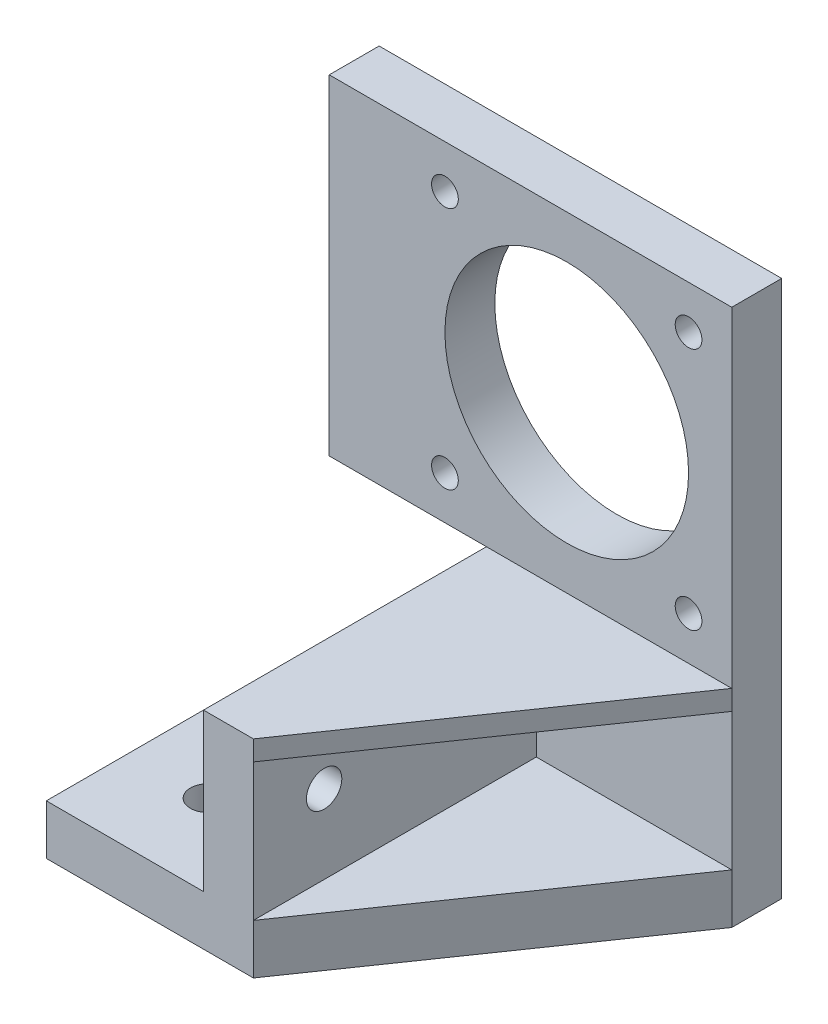
ISO-10303-21;
HEADER;
FILE_DESCRIPTION(('STEP AP214'),'2;1');
FILE_NAME('part.step','',(''),(''),'','','');
FILE_SCHEMA(('AUTOMOTIVE_DESIGN { 1 0 10303 214 1 1 1 1 }'));
ENDSEC;
DATA;
#1=APPLICATION_CONTEXT('core data for automotive mechanical design processes');
#2=APPLICATION_PROTOCOL_DEFINITION('international standard','automotive_design',2000,#1);
#3=PRODUCT_CONTEXT('',#1,'mechanical');
#4=PRODUCT('Part','Part','',(#3));
#5=PRODUCT_RELATED_PRODUCT_CATEGORY('part','',(#4));
#6=PRODUCT_DEFINITION_FORMATION('','',#4);
#7=PRODUCT_DEFINITION_CONTEXT('part definition',#1,'design');
#8=PRODUCT_DEFINITION('design','',#6,#7);
#9=PRODUCT_DEFINITION_SHAPE('','',#8);
#10=(LENGTH_UNIT() NAMED_UNIT(*) SI_UNIT(.MILLI.,.METRE.));
#11=(NAMED_UNIT(*) PLANE_ANGLE_UNIT() SI_UNIT($,.RADIAN.));
#12=(NAMED_UNIT(*) SI_UNIT($,.STERADIAN.) SOLID_ANGLE_UNIT());
#13=UNCERTAINTY_MEASURE_WITH_UNIT(LENGTH_MEASURE(1.E-05),#10,'distance_accuracy_value','');
#14=(GEOMETRIC_REPRESENTATION_CONTEXT(3) GLOBAL_UNCERTAINTY_ASSIGNED_CONTEXT((#13)) GLOBAL_UNIT_ASSIGNED_CONTEXT((#10,
#11,#12)) REPRESENTATION_CONTEXT('',''));
#15=CARTESIAN_POINT('',(0.,0.,0.));
#16=DIRECTION('',(0.,0.,1.));
#17=DIRECTION('',(1.,0.,0.));
#18=AXIS2_PLACEMENT_3D('',#15,#16,#17);
#19=CARTESIAN_POINT('',(0.,0.,78.0386444913883));
#20=DIRECTION('',(0.,0.,-1.));
#21=DIRECTION('',(-1.,0.,0.));
#22=AXIS2_PLACEMENT_3D('',#19,#20,#21);
#23=PLANE('',#22);
#24=CARTESIAN_POINT('',(4.72008915368407,15.4999999999972,78.0386444913883));
#25=DIRECTION('',(0.,0.,-1.));
#26=DIRECTION('',(-1.,0.,0.));
#27=AXIS2_PLACEMENT_3D('',#24,#25,#26);
#28=CIRCLE('',#27,1.7);
#29=CARTESIAN_POINT('',(3.02008915368406,15.4999999999972,78.0386444913883));
#30=VERTEX_POINT('',#29);
#31=EDGE_CURVE('E173',#30,#30,#28,.T.);
#32=ORIENTED_EDGE('',*,*,#31,.T.);
#33=EDGE_LOOP('',(#32));
#34=FACE_BOUND('',#33,.T.);
#35=CARTESIAN_POINT('',(20.2200891536841,30.9999999999972,78.0386444913883));
#36=DIRECTION('',(0.,0.,-1.));
#37=DIRECTION('',(-1.,0.,0.));
#38=AXIS2_PLACEMENT_3D('',#35,#36,#37);
#39=CIRCLE('',#38,15.5);
#40=CARTESIAN_POINT('',(4.72008915368407,30.9999999999972,78.0386444913883));
#41=VERTEX_POINT('',#40);
#42=EDGE_CURVE('E247',#41,#41,#39,.T.);
#43=ORIENTED_EDGE('',*,*,#42,.T.);
#44=EDGE_LOOP('',(#43));
#45=FACE_BOUND('',#44,.T.);
#46=CARTESIAN_POINT('',(4.72008915368407,46.4999999999972,78.0386444913883));
#47=DIRECTION('',(0.,0.,-1.));
#48=DIRECTION('',(-1.,0.,0.));
#49=AXIS2_PLACEMENT_3D('',#46,#47,#48);
#50=CIRCLE('',#49,1.7);
#51=CARTESIAN_POINT('',(3.02008915368407,46.4999999999972,78.0386444913883));
#52=VERTEX_POINT('',#51);
#53=EDGE_CURVE('E250',#52,#52,#50,.T.);
#54=ORIENTED_EDGE('',*,*,#53,.T.);
#55=EDGE_LOOP('',(#54));
#56=FACE_BOUND('',#55,.T.);
#57=CARTESIAN_POINT('',(35.7200891536841,46.4999999999972,78.0386444913883));
#58=DIRECTION('',(0.,0.,-1.));
#59=DIRECTION('',(-1.,0.,0.));
#60=AXIS2_PLACEMENT_3D('',#57,#58,#59);
#61=CIRCLE('',#60,1.7);
#62=CARTESIAN_POINT('',(34.0200891536841,46.4999999999972,78.0386444913883));
#63=VERTEX_POINT('',#62);
#64=EDGE_CURVE('E253',#63,#63,#61,.T.);
#65=ORIENTED_EDGE('',*,*,#64,.T.);
#66=EDGE_LOOP('',(#65));
#67=FACE_BOUND('',#66,.T.);
#68=CARTESIAN_POINT('',(35.7200891536841,15.4999999999972,78.0386444913883));
#69=DIRECTION('',(0.,0.,-1.));
#70=DIRECTION('',(-1.,0.,0.));
#71=AXIS2_PLACEMENT_3D('',#68,#69,#70);
#72=CIRCLE('',#71,1.7);
#73=CARTESIAN_POINT('',(34.0200891536841,15.4999999999972,78.0386444913883));
#74=VERTEX_POINT('',#73);
#75=EDGE_CURVE('E256',#74,#74,#72,.T.);
#76=ORIENTED_EDGE('',*,*,#75,.T.);
#77=EDGE_LOOP('',(#76));
#78=FACE_BOUND('',#77,.T.);
#79=DIRECTION('',(1.,0.,0.));
#80=VECTOR('',#79,1.);
#81=CARTESIAN_POINT('',(0.,9.99999999999721,78.0386444913883));
#82=LINE('',#81,#80);
#83=CARTESIAN_POINT('',(9.99999999991598,9.99999999999721,78.0386444913883));
#84=VERTEX_POINT('',#83);
#85=CARTESIAN_POINT('',(41.2200891536841,9.99999999999721,78.0386444913883));
#86=VERTEX_POINT('',#85);
#87=EDGE_CURVE('E164',#84,#86,#82,.T.);
#88=ORIENTED_EDGE('',*,*,#87,.T.);
#89=DIRECTION('',(0.,1.,0.));
#90=VECTOR('',#89,1.);
#91=CARTESIAN_POINT('',(41.2200891536841,0.,78.0386444913883));
#92=LINE('',#91,#90);
#93=CARTESIAN_POINT('',(41.2200891536841,51.9999999999972,78.0386444913883));
#94=VERTEX_POINT('',#93);
#95=EDGE_CURVE('E166',#86,#94,#92,.T.);
#96=ORIENTED_EDGE('',*,*,#95,.T.);
#97=DIRECTION('',(1.,0.,0.));
#98=VECTOR('',#97,1.);
#99=CARTESIAN_POINT('',(0.,51.9999999999972,78.0386444913883));
#100=LINE('',#99,#98);
#101=CARTESIAN_POINT('',(-10.0000000001687,51.9999999999972,78.0386444913883));
#102=VERTEX_POINT('',#101);
#103=EDGE_CURVE('E184',#102,#94,#100,.T.);
#104=ORIENTED_EDGE('',*,*,#103,.F.);
#105=DIRECTION('',(0.,1.,0.));
#106=VECTOR('',#105,1.);
#107=CARTESIAN_POINT('',(-10.0000000001687,9.99999999999721,78.0386444913883));
#108=LINE('',#107,#106);
#109=CARTESIAN_POINT('',(-10.0000000001687,9.99999999999721,78.0386444913883));
#110=VERTEX_POINT('',#109);
#111=EDGE_CURVE('E286',#110,#102,#108,.T.);
#112=ORIENTED_EDGE('',*,*,#111,.F.);
#113=EDGE_CURVE('E169',#110,#84,#82,.T.);
#114=ORIENTED_EDGE('',*,*,#113,.T.);
#115=EDGE_LOOP('',(#88,#96,#104,#112,#114));
#116=FACE_BOUND('',#115,.T.);
#117=ADVANCED_FACE('F67',(#34,#45,#56,#67,#78,#116),#23,.F.);
#118=CARTESIAN_POINT('',(16.349999999916,0.,71.6886444913883));
#119=DIRECTION('',(-1.,0.,0.));
#120=DIRECTION('',(0.,0.,1.));
#121=AXIS2_PLACEMENT_3D('',#118,#119,#120);
#122=PLANE('',#121);
#123=CARTESIAN_POINT('',(16.349999999916,0.,105.038644402888));
#124=DIRECTION('',(1.,0.,0.));
#125=DIRECTION('',(0.,0.,-1.));
#126=AXIS2_PLACEMENT_3D('',#123,#124,#125);
#127=CIRCLE('',#126,2.24999999999999);
#128=CARTESIAN_POINT('',(16.349999999916,0.,102.788644402888));
#129=VERTEX_POINT('',#128);
#130=EDGE_CURVE('E217',#129,#129,#127,.T.);
#131=ORIENTED_EDGE('',*,*,#130,.F.);
#132=EDGE_LOOP('',(#131));
#133=FACE_BOUND('',#132,.T.);
#134=CARTESIAN_POINT('',(16.349999999916,0.,87.0386444618883));
#135=DIRECTION('',(1.,0.,0.));
#136=DIRECTION('',(0.,0.,-1.));
#137=AXIS2_PLACEMENT_3D('',#134,#135,#136);
#138=CIRCLE('',#137,2.24999999999999);
#139=CARTESIAN_POINT('',(16.349999999916,0.,84.7886444618883));
#140=VERTEX_POINT('',#139);
#141=EDGE_CURVE('E220',#140,#140,#138,.T.);
#142=ORIENTED_EDGE('',*,*,#141,.F.);
#143=EDGE_LOOP('',(#142));
#144=FACE_BOUND('',#143,.T.);
#145=DIRECTION('',(0.,-1.,0.));
#146=VECTOR('',#145,1.);
#147=CARTESIAN_POINT('',(16.349999999916,0.,78.0386444913883));
#148=LINE('',#147,#146);
#149=CARTESIAN_POINT('',(16.349999999916,7.45999999999721,78.0386444913883));
#150=VERTEX_POINT('',#149);
#151=CARTESIAN_POINT('',(16.349999999916,-10.0000000000028,78.0386444913883));
#152=VERTEX_POINT('',#151);
#153=EDGE_CURVE('E245',#150,#152,#148,.T.);
#154=ORIENTED_EDGE('',*,*,#153,.F.);
#155=DIRECTION('',(0.,0.,1.));
#156=VECTOR('',#155,1.);
#157=CARTESIAN_POINT('',(16.349999999916,7.45999999999721,78.0386444913883));
#158=LINE('',#157,#156);
#159=CARTESIAN_POINT('',(16.349999999916,7.45999999999721,114.038644373388));
#160=VERTEX_POINT('',#159);
#161=EDGE_CURVE('E91',#150,#160,#158,.T.);
#162=ORIENTED_EDGE('',*,*,#161,.T.);
#163=DIRECTION('',(0.,-1.,0.));
#164=VECTOR('',#163,1.);
#165=CARTESIAN_POINT('',(16.349999999916,0.,114.038644373388));
#166=LINE('',#165,#164);
#167=CARTESIAN_POINT('',(16.349999999916,-10.0000000000028,114.038644373388));
#168=VERTEX_POINT('',#167);
#169=EDGE_CURVE('E284',#160,#168,#166,.T.);
#170=ORIENTED_EDGE('',*,*,#169,.T.);
#171=DIRECTION('',(0.,0.,-1.));
#172=VECTOR('',#171,1.);
#173=CARTESIAN_POINT('',(16.349999999916,-10.0000000000028,78.0386444913883));
#174=LINE('',#173,#172);
#175=EDGE_CURVE('E227',#168,#152,#174,.T.);
#176=ORIENTED_EDGE('',*,*,#175,.T.);
#177=EDGE_LOOP('',(#154,#162,#170,#176));
#178=FACE_BOUND('',#177,.T.);
#179=ADVANCED_FACE('F69',(#133,#144,#178),#122,.F.);
#180=CARTESIAN_POINT('',(41.2200891536841,-10.0000000000028,78.0386444913883));
#181=VERTEX_POINT('',#180);
#182=CARTESIAN_POINT('',(41.2200891536841,7.45999999999721,78.0386444913883));
#183=VERTEX_POINT('',#182);
#184=EDGE_CURVE('E183',#181,#183,#92,.T.);
#185=ORIENTED_EDGE('',*,*,#184,.T.);
#186=DIRECTION('',(-1.,0.,0.));
#187=VECTOR('',#186,1.);
#188=CARTESIAN_POINT('',(41.2200891536841,7.45999999999721,78.0386444913883));
#189=LINE('',#188,#187);
#190=EDGE_CURVE('E84',#183,#150,#189,.T.);
#191=ORIENTED_EDGE('',*,*,#190,.T.);
#192=ORIENTED_EDGE('',*,*,#153,.T.);
#193=DIRECTION('',(1.,0.,0.));
#194=VECTOR('',#193,1.);
#195=CARTESIAN_POINT('',(41.2200891536841,-10.0000000000028,78.0386444913883));
#196=LINE('',#195,#194);
#197=EDGE_CURVE('E230',#152,#181,#196,.T.);
#198=ORIENTED_EDGE('',*,*,#197,.T.);
#199=EDGE_LOOP('',(#185,#191,#192,#198));
#200=FACE_BOUND('',#199,.T.);
#201=ADVANCED_FACE('F348',(#200),#23,.F.);
#202=CARTESIAN_POINT('',(0.,9.99999999999721,71.6886444913883));
#203=DIRECTION('',(0.,1.,0.));
#204=DIRECTION('',(0.,0.,1.));
#205=AXIS2_PLACEMENT_3D('',#202,#203,#204);
#206=PLANE('',#205);
#207=DIRECTION('',(-1.,0.,0.));
#208=VECTOR('',#207,1.);
#209=CARTESIAN_POINT('',(0.,9.99999999999721,114.038644373388));
#210=LINE('',#209,#208);
#211=CARTESIAN_POINT('',(16.349999999916,9.99999999999721,114.038644373388));
#212=VERTEX_POINT('',#211);
#213=CARTESIAN_POINT('',(9.99999999991598,9.99999999999721,114.038644373388));
#214=VERTEX_POINT('',#213);
#215=EDGE_CURVE('E200',#212,#214,#210,.T.);
#216=ORIENTED_EDGE('',*,*,#215,.F.);
#217=DIRECTION('',(0.568391059323801,0.,-0.822758533034309));
#218=VECTOR('',#217,1.);
#219=CARTESIAN_POINT('',(16.349999999916,9.99999999999721,114.038644373388));
#220=LINE('',#219,#218);
#221=EDGE_CURVE('E192',#212,#86,#220,.T.);
#222=ORIENTED_EDGE('',*,*,#221,.T.);
#223=ORIENTED_EDGE('',*,*,#87,.F.);
#224=DIRECTION('',(0.,0.,1.));
#225=VECTOR('',#224,1.);
#226=CARTESIAN_POINT('',(9.99999999991598,9.99999999999721,71.6886444913883));
#227=LINE('',#226,#225);
#228=EDGE_CURVE('E307',#84,#214,#227,.T.);
#229=ORIENTED_EDGE('',*,*,#228,.T.);
#230=EDGE_LOOP('',(#216,#222,#223,#229));
#231=FACE_BOUND('',#230,.T.);
#232=ADVANCED_FACE('F198',(#231),#206,.T.);
#233=CARTESIAN_POINT('',(0.,-16.3500000000028,71.6886444913883));
#234=DIRECTION('',(0.,-1.,0.));
#235=DIRECTION('',(0.,0.,-1.));
#236=AXIS2_PLACEMENT_3D('',#233,#234,#235);
#237=PLANE('',#236);
#238=CARTESIAN_POINT('',(-8.4013759911749E-11,-16.3500000000028,82.2761444618883));
#239=DIRECTION('',(0.,-1.,0.));
#240=DIRECTION('',(0.,0.,-1.));
#241=AXIS2_PLACEMENT_3D('',#238,#239,#240);
#242=CIRCLE('',#241,2.24999999999999);
#243=CARTESIAN_POINT('',(-8.4013759911749E-11,-16.3500000000028,80.0261444618883));
#244=VERTEX_POINT('',#243);
#245=EDGE_CURVE('E195',#244,#244,#242,.T.);
#246=ORIENTED_EDGE('',*,*,#245,.F.);
#247=EDGE_LOOP('',(#246));
#248=FACE_BOUND('',#247,.T.);
#249=CARTESIAN_POINT('',(-8.40213315589367E-11,-16.3500000000028,103.451144402888));
#250=DIRECTION('',(0.,-1.,0.));
#251=DIRECTION('',(0.,0.,-1.));
#252=AXIS2_PLACEMENT_3D('',#249,#250,#251);
#253=CIRCLE('',#252,2.24999999999999);
#254=CARTESIAN_POINT('',(-8.40213315589367E-11,-16.3500000000028,101.201144402888));
#255=VERTEX_POINT('',#254);
#256=EDGE_CURVE('E211',#255,#255,#253,.T.);
#257=ORIENTED_EDGE('',*,*,#256,.F.);
#258=EDGE_LOOP('',(#257));
#259=FACE_BOUND('',#258,.T.);
#260=DIRECTION('',(-0.568391059323801,0.,0.822758533034309));
#261=VECTOR('',#260,1.);
#262=CARTESIAN_POINT('',(16.349999999916,-16.3500000000028,114.038644373388));
#263=LINE('',#262,#261);
#264=CARTESIAN_POINT('',(41.2200891536841,-16.3500000000028,78.0386444913883));
#265=VERTEX_POINT('',#264);
#266=CARTESIAN_POINT('',(16.349999999916,-16.3500000000028,114.038644373388));
#267=VERTEX_POINT('',#266);
#268=EDGE_CURVE('E226',#265,#267,#263,.T.);
#269=ORIENTED_EDGE('',*,*,#268,.T.);
#270=DIRECTION('',(1.,0.,0.));
#271=VECTOR('',#270,1.);
#272=CARTESIAN_POINT('',(0.,-16.3500000000028,114.038644373388));
#273=LINE('',#272,#271);
#274=CARTESIAN_POINT('',(-10.000000000084,-16.3500000000028,114.038644373388));
#275=VERTEX_POINT('',#274);
#276=EDGE_CURVE('E300',#275,#267,#273,.T.);
#277=ORIENTED_EDGE('',*,*,#276,.F.);
#278=DIRECTION('',(0.,0.,1.));
#279=VECTOR('',#278,1.);
#280=CARTESIAN_POINT('',(-10.000000000084,-16.3500000000028,71.6886444913883));
#281=LINE('',#280,#279);
#282=CARTESIAN_POINT('',(-10.000000000084,-16.3500000000028,71.6886444913883));
#283=VERTEX_POINT('',#282);
#284=EDGE_CURVE('E12',#283,#275,#281,.T.);
#285=ORIENTED_EDGE('',*,*,#284,.F.);
#286=DIRECTION('',(1.,0.,0.));
#287=VECTOR('',#286,1.);
#288=CARTESIAN_POINT('',(0.,-16.3500000000028,71.6886444913883));
#289=LINE('',#288,#287);
#290=CARTESIAN_POINT('',(41.2200891536841,-16.3500000000028,71.6886444913883));
#291=VERTEX_POINT('',#290);
#292=EDGE_CURVE('E305',#283,#291,#289,.T.);
#293=ORIENTED_EDGE('',*,*,#292,.T.);
#294=DIRECTION('',(0.,0.,-1.));
#295=VECTOR('',#294,1.);
#296=CARTESIAN_POINT('',(41.2200891536841,-16.3500000000028,78.0386444913883));
#297=LINE('',#296,#295);
#298=EDGE_CURVE('E281',#265,#291,#297,.T.);
#299=ORIENTED_EDGE('',*,*,#298,.F.);
#300=EDGE_LOOP('',(#269,#277,#285,#293,#299));
#301=FACE_BOUND('',#300,.T.);
#302=ADVANCED_FACE('F360',(#248,#259,#301),#237,.T.);
#303=CARTESIAN_POINT('',(-10.000000000084,0.,71.6886444913883));
#304=DIRECTION('',(-1.,0.,0.));
#305=DIRECTION('',(0.,0.,1.));
#306=AXIS2_PLACEMENT_3D('',#303,#304,#305);
#307=PLANE('',#306);
#308=DIRECTION('',(0.,-1.,0.));
#309=VECTOR('',#308,1.);
#310=CARTESIAN_POINT('',(-10.000000000084,0.,114.038644373388));
#311=LINE('',#310,#309);
#312=CARTESIAN_POINT('',(-10.000000000084,-10.0000000000028,114.038644373388));
#313=VERTEX_POINT('',#312);
#314=EDGE_CURVE('E316',#313,#275,#311,.T.);
#315=ORIENTED_EDGE('',*,*,#314,.F.);
#316=DIRECTION('',(0.,0.,1.));
#317=VECTOR('',#316,1.);
#318=CARTESIAN_POINT('',(-10.000000000084,-10.0000000000028,71.6886444913883));
#319=LINE('',#318,#317);
#320=CARTESIAN_POINT('',(-10.000000000084,-10.0000000000028,71.6886444913883));
#321=VERTEX_POINT('',#320);
#322=EDGE_CURVE('E76',#321,#313,#319,.T.);
#323=ORIENTED_EDGE('',*,*,#322,.F.);
#324=DIRECTION('',(0.,-1.,0.));
#325=VECTOR('',#324,1.);
#326=CARTESIAN_POINT('',(-10.000000000084,0.,71.6886444913883));
#327=LINE('',#326,#325);
#328=EDGE_CURVE('E302',#321,#283,#327,.T.);
#329=ORIENTED_EDGE('',*,*,#328,.T.);
#330=ORIENTED_EDGE('',*,*,#284,.T.);
#331=EDGE_LOOP('',(#315,#323,#329,#330));
#332=FACE_BOUND('',#331,.T.);
#333=ADVANCED_FACE('F402',(#332),#307,.T.);
#334=CARTESIAN_POINT('',(0.,-10.0000000000028,71.6886444913883));
#335=DIRECTION('',(0.,-1.,0.));
#336=DIRECTION('',(1.,0.,0.));
#337=AXIS2_PLACEMENT_3D('',#334,#335,#336);
#338=PLANE('',#337);
#339=CARTESIAN_POINT('',(-8.4013759911749E-11,-10.0000000000028,82.2761444618883));
#340=DIRECTION('',(0.,-1.,0.));
#341=DIRECTION('',(1.,0.,0.));
#342=AXIS2_PLACEMENT_3D('',#339,#340,#341);
#343=CIRCLE('',#342,2.24999999999999);
#344=CARTESIAN_POINT('',(2.24999999991597,-10.0000000000028,82.2761444618883));
#345=VERTEX_POINT('',#344);
#346=EDGE_CURVE('E208',#345,#345,#343,.T.);
#347=ORIENTED_EDGE('',*,*,#346,.T.);
#348=EDGE_LOOP('',(#347));
#349=FACE_BOUND('',#348,.T.);
#350=CARTESIAN_POINT('',(-8.40213315589367E-11,-10.0000000000028,103.451144402888));
#351=DIRECTION('',(0.,-1.,0.));
#352=DIRECTION('',(1.,0.,0.));
#353=AXIS2_PLACEMENT_3D('',#350,#351,#352);
#354=CIRCLE('',#353,2.24999999999999);
#355=CARTESIAN_POINT('',(2.24999999991596,-10.0000000000028,103.451144402888));
#356=VERTEX_POINT('',#355);
#357=EDGE_CURVE('E214',#356,#356,#354,.T.);
#358=ORIENTED_EDGE('',*,*,#357,.T.);
#359=EDGE_LOOP('',(#358));
#360=FACE_BOUND('',#359,.T.);
#361=DIRECTION('',(1.,0.,0.));
#362=VECTOR('',#361,1.);
#363=CARTESIAN_POINT('',(0.,-10.0000000000028,114.038644373388));
#364=LINE('',#363,#362);
#365=CARTESIAN_POINT('',(9.99999999991598,-10.0000000000028,114.038644373388));
#366=VERTEX_POINT('',#365);
#367=EDGE_CURVE('E314',#313,#366,#364,.T.);
#368=ORIENTED_EDGE('',*,*,#367,.T.);
#369=DIRECTION('',(0.,0.,1.));
#370=VECTOR('',#369,1.);
#371=CARTESIAN_POINT('',(9.99999999991598,-10.0000000000028,71.6886444913883));
#372=LINE('',#371,#370);
#373=CARTESIAN_POINT('',(9.99999999991598,-10.0000000000028,71.6886444913883));
#374=VERTEX_POINT('',#373);
#375=EDGE_CURVE('E322',#374,#366,#372,.T.);
#376=ORIENTED_EDGE('',*,*,#375,.F.);
#377=DIRECTION('',(1.,0.,0.));
#378=VECTOR('',#377,1.);
#379=CARTESIAN_POINT('',(0.,-10.0000000000028,71.6886444913883));
#380=LINE('',#379,#378);
#381=EDGE_CURVE('E299',#321,#374,#380,.T.);
#382=ORIENTED_EDGE('',*,*,#381,.F.);
#383=ORIENTED_EDGE('',*,*,#322,.T.);
#384=EDGE_LOOP('',(#368,#376,#382,#383));
#385=FACE_BOUND('',#384,.T.);
#386=ADVANCED_FACE('F399',(#349,#360,#385),#338,.F.);
#387=CARTESIAN_POINT('',(9.99999999991598,0.,71.6886444913883));
#388=DIRECTION('',(1.,0.,0.));
#389=DIRECTION('',(0.,0.,-1.));
#390=AXIS2_PLACEMENT_3D('',#387,#388,#389);
#391=PLANE('',#390);
#392=CARTESIAN_POINT('',(9.99999999991598,0.,105.038644402888));
#393=DIRECTION('',(1.,0.,0.));
#394=DIRECTION('',(0.,0.,-1.));
#395=AXIS2_PLACEMENT_3D('',#392,#393,#394);
#396=CIRCLE('',#395,2.24999999999999);
#397=CARTESIAN_POINT('',(9.99999999991598,0.,102.788644402888));
#398=VERTEX_POINT('',#397);
#399=EDGE_CURVE('E71',#398,#398,#396,.T.);
#400=ORIENTED_EDGE('',*,*,#399,.T.);
#401=EDGE_LOOP('',(#400));
#402=FACE_BOUND('',#401,.T.);
#403=CARTESIAN_POINT('',(9.99999999991598,0.,87.0386444618883));
#404=DIRECTION('',(1.,0.,0.));
#405=DIRECTION('',(0.,0.,-1.));
#406=AXIS2_PLACEMENT_3D('',#403,#404,#405);
#407=CIRCLE('',#406,2.24999999999999);
#408=CARTESIAN_POINT('',(9.99999999991598,0.,84.7886444618883));
#409=VERTEX_POINT('',#408);
#410=EDGE_CURVE('E223',#409,#409,#407,.T.);
#411=ORIENTED_EDGE('',*,*,#410,.T.);
#412=EDGE_LOOP('',(#411));
#413=FACE_BOUND('',#412,.T.);
#414=DIRECTION('',(0.,1.,0.));
#415=VECTOR('',#414,1.);
#416=CARTESIAN_POINT('',(9.99999999991598,0.,114.038644373388));
#417=LINE('',#416,#415);
#418=EDGE_CURVE('E311',#366,#214,#417,.T.);
#419=ORIENTED_EDGE('',*,*,#418,.T.);
#420=ORIENTED_EDGE('',*,*,#228,.F.);
#421=CARTESIAN_POINT('',(9.99999999991598,9.99999999999721,71.6886444913883));
#422=VERTEX_POINT('',#421);
#423=EDGE_CURVE('E324',#422,#84,#227,.T.);
#424=ORIENTED_EDGE('',*,*,#423,.F.);
#425=DIRECTION('',(0.,1.,0.));
#426=VECTOR('',#425,1.);
#427=CARTESIAN_POINT('',(9.99999999991598,0.,71.6886444913883));
#428=LINE('',#427,#426);
#429=EDGE_CURVE('E296',#374,#422,#428,.T.);
#430=ORIENTED_EDGE('',*,*,#429,.F.);
#431=ORIENTED_EDGE('',*,*,#375,.T.);
#432=EDGE_LOOP('',(#419,#420,#424,#430,#431));
#433=FACE_BOUND('',#432,.T.);
#434=ADVANCED_FACE('F329',(#402,#413,#433),#391,.F.);
#435=CARTESIAN_POINT('',(0.,0.,71.6886444913883));
#436=DIRECTION('',(0.,0.,1.));
#437=DIRECTION('',(1.,0.,0.));
#438=AXIS2_PLACEMENT_3D('',#435,#436,#437);
#439=PLANE('',#438);
#440=ORIENTED_EDGE('',*,*,#429,.T.);
#441=DIRECTION('',(1.,0.,0.));
#442=VECTOR('',#441,1.);
#443=CARTESIAN_POINT('',(0.,9.99999999999721,71.6886444913883));
#444=LINE('',#443,#442);
#445=CARTESIAN_POINT('',(-10.0000000001687,9.99999999999721,71.6886444913883));
#446=VERTEX_POINT('',#445);
#447=EDGE_CURVE('E262',#446,#422,#444,.T.);
#448=ORIENTED_EDGE('',*,*,#447,.F.);
#449=DIRECTION('',(0.,1.,0.));
#450=VECTOR('',#449,1.);
#451=CARTESIAN_POINT('',(-10.0000000001687,9.99999999999721,71.6886444913883));
#452=LINE('',#451,#450);
#453=CARTESIAN_POINT('',(-10.0000000001687,51.9999999999972,71.6886444913883));
#454=VERTEX_POINT('',#453);
#455=EDGE_CURVE('E240',#446,#454,#452,.T.);
#456=ORIENTED_EDGE('',*,*,#455,.T.);
#457=DIRECTION('',(1.,0.,0.));
#458=VECTOR('',#457,1.);
#459=CARTESIAN_POINT('',(0.,51.9999999999972,71.6886444913883));
#460=LINE('',#459,#458);
#461=CARTESIAN_POINT('',(41.2200891536841,51.9999999999972,71.6886444913883));
#462=VERTEX_POINT('',#461);
#463=EDGE_CURVE('E265',#454,#462,#460,.T.);
#464=ORIENTED_EDGE('',*,*,#463,.T.);
#465=DIRECTION('',(0.,1.,0.));
#466=VECTOR('',#465,1.);
#467=CARTESIAN_POINT('',(41.2200891536841,0.,71.6886444913883));
#468=LINE('',#467,#466);
#469=EDGE_CURVE('E268',#291,#462,#468,.T.);
#470=ORIENTED_EDGE('',*,*,#469,.F.);
#471=ORIENTED_EDGE('',*,*,#292,.F.);
#472=ORIENTED_EDGE('',*,*,#328,.F.);
#473=ORIENTED_EDGE('',*,*,#381,.T.);
#474=EDGE_LOOP('',(#440,#448,#456,#464,#470,#471,#472,#473));
#475=FACE_BOUND('',#474,.T.);
#476=CARTESIAN_POINT('',(4.72008915368407,15.4999999999972,71.6886444913883));
#477=DIRECTION('',(0.,0.,-1.));
#478=DIRECTION('',(-1.,0.,0.));
#479=AXIS2_PLACEMENT_3D('',#476,#477,#478);
#480=CIRCLE('',#479,1.7);
#481=CARTESIAN_POINT('',(3.02008915368406,15.4999999999972,71.6886444913883));
#482=VERTEX_POINT('',#481);
#483=EDGE_CURVE('E259',#482,#482,#480,.T.);
#484=ORIENTED_EDGE('',*,*,#483,.F.);
#485=EDGE_LOOP('',(#484));
#486=FACE_BOUND('',#485,.T.);
#487=CARTESIAN_POINT('',(20.2200891536841,30.9999999999972,71.6886444913883));
#488=DIRECTION('',(0.,0.,-1.));
#489=DIRECTION('',(-1.,0.,0.));
#490=AXIS2_PLACEMENT_3D('',#487,#488,#489);
#491=CIRCLE('',#490,15.5);
#492=CARTESIAN_POINT('',(4.72008915368407,30.9999999999972,71.6886444913883));
#493=VERTEX_POINT('',#492);
#494=EDGE_CURVE('E270',#493,#493,#491,.T.);
#495=ORIENTED_EDGE('',*,*,#494,.F.);
#496=EDGE_LOOP('',(#495));
#497=FACE_BOUND('',#496,.T.);
#498=CARTESIAN_POINT('',(4.72008915368407,46.4999999999972,71.6886444913883));
#499=DIRECTION('',(0.,0.,-1.));
#500=DIRECTION('',(-1.,0.,0.));
#501=AXIS2_PLACEMENT_3D('',#498,#499,#500);
#502=CIRCLE('',#501,1.7);
#503=CARTESIAN_POINT('',(3.02008915368407,46.4999999999972,71.6886444913883));
#504=VERTEX_POINT('',#503);
#505=EDGE_CURVE('E273',#504,#504,#502,.T.);
#506=ORIENTED_EDGE('',*,*,#505,.F.);
#507=EDGE_LOOP('',(#506));
#508=FACE_BOUND('',#507,.T.);
#509=CARTESIAN_POINT('',(35.7200891536841,46.4999999999972,71.6886444913883));
#510=DIRECTION('',(0.,0.,-1.));
#511=DIRECTION('',(-1.,0.,0.));
#512=AXIS2_PLACEMENT_3D('',#509,#510,#511);
#513=CIRCLE('',#512,1.7);
#514=CARTESIAN_POINT('',(34.0200891536841,46.4999999999972,71.6886444913883));
#515=VERTEX_POINT('',#514);
#516=EDGE_CURVE('E276',#515,#515,#513,.T.);
#517=ORIENTED_EDGE('',*,*,#516,.F.);
#518=EDGE_LOOP('',(#517));
#519=FACE_BOUND('',#518,.T.);
#520=CARTESIAN_POINT('',(35.7200891536841,15.4999999999972,71.6886444913883));
#521=DIRECTION('',(0.,0.,-1.));
#522=DIRECTION('',(-1.,0.,0.));
#523=AXIS2_PLACEMENT_3D('',#520,#521,#522);
#524=CIRCLE('',#523,1.7);
#525=CARTESIAN_POINT('',(34.0200891536841,15.4999999999972,71.6886444913883));
#526=VERTEX_POINT('',#525);
#527=EDGE_CURVE('E242',#526,#526,#524,.T.);
#528=ORIENTED_EDGE('',*,*,#527,.F.);
#529=EDGE_LOOP('',(#528));
#530=FACE_BOUND('',#529,.T.);
#531=ADVANCED_FACE('F414',(#475,#486,#497,#508,#519,#530),#439,.F.);
#532=CARTESIAN_POINT('',(0.,0.,114.038644373388));
#533=DIRECTION('',(0.,0.,1.));
#534=DIRECTION('',(1.,0.,0.));
#535=AXIS2_PLACEMENT_3D('',#532,#533,#534);
#536=PLANE('',#535);
#537=EDGE_CURVE('E308',#212,#160,#166,.T.);
#538=ORIENTED_EDGE('',*,*,#537,.F.);
#539=ORIENTED_EDGE('',*,*,#215,.T.);
#540=ORIENTED_EDGE('',*,*,#418,.F.);
#541=ORIENTED_EDGE('',*,*,#367,.F.);
#542=ORIENTED_EDGE('',*,*,#314,.T.);
#543=ORIENTED_EDGE('',*,*,#276,.T.);
#544=DIRECTION('',(0.,-1.,0.));
#545=VECTOR('',#544,1.);
#546=CARTESIAN_POINT('',(16.349999999916,-10.0000000000028,114.038644373388));
#547=LINE('',#546,#545);
#548=EDGE_CURVE('E236',#168,#267,#547,.T.);
#549=ORIENTED_EDGE('',*,*,#548,.F.);
#550=ORIENTED_EDGE('',*,*,#169,.F.);
#551=EDGE_LOOP('',(#538,#539,#540,#541,#542,#543,#549,#550));
#552=FACE_BOUND('',#551,.T.);
#553=ADVANCED_FACE('F334',(#552),#536,.T.);
#554=CARTESIAN_POINT('',(0.,9.99999999999721,78.0386444913883));
#555=DIRECTION('',(0.,1.,0.));
#556=DIRECTION('',(0.,0.,1.));
#557=AXIS2_PLACEMENT_3D('',#554,#555,#556);
#558=PLANE('',#557);
#559=ORIENTED_EDGE('',*,*,#447,.T.);
#560=ORIENTED_EDGE('',*,*,#423,.T.);
#561=ORIENTED_EDGE('',*,*,#113,.F.);
#562=DIRECTION('',(0.,0.,-1.));
#563=VECTOR('',#562,1.);
#564=CARTESIAN_POINT('',(-10.0000000001687,9.99999999999721,78.0386444913883));
#565=LINE('',#564,#563);
#566=EDGE_CURVE('E289',#110,#446,#565,.T.);
#567=ORIENTED_EDGE('',*,*,#566,.T.);
#568=EDGE_LOOP('',(#559,#560,#561,#567));
#569=FACE_BOUND('',#568,.T.);
#570=ADVANCED_FACE('F422',(#569),#558,.F.);
#571=CARTESIAN_POINT('',(41.2200891536841,0.,78.0386444913883));
#572=DIRECTION('',(-1.,0.,0.));
#573=DIRECTION('',(0.,0.,1.));
#574=AXIS2_PLACEMENT_3D('',#571,#572,#573);
#575=PLANE('',#574);
#576=ORIENTED_EDGE('',*,*,#469,.T.);
#577=DIRECTION('',(0.,0.,-1.));
#578=VECTOR('',#577,1.);
#579=CARTESIAN_POINT('',(41.2200891536841,51.9999999999972,78.0386444913883));
#580=LINE('',#579,#578);
#581=EDGE_CURVE('E181',#94,#462,#580,.T.);
#582=ORIENTED_EDGE('',*,*,#581,.F.);
#583=ORIENTED_EDGE('',*,*,#95,.F.);
#584=DIRECTION('',(0.,1.,0.));
#585=VECTOR('',#584,1.);
#586=CARTESIAN_POINT('',(41.2200891536841,7.45999999999721,78.0386444913883));
#587=LINE('',#586,#585);
#588=EDGE_CURVE('E180',#183,#86,#587,.T.);
#589=ORIENTED_EDGE('',*,*,#588,.F.);
#590=ORIENTED_EDGE('',*,*,#184,.F.);
#591=EDGE_CURVE('E186',#265,#181,#92,.T.);
#592=ORIENTED_EDGE('',*,*,#591,.F.);
#593=ORIENTED_EDGE('',*,*,#298,.T.);
#594=EDGE_LOOP('',(#576,#582,#583,#589,#590,#592,#593));
#595=FACE_BOUND('',#594,.T.);
#596=ADVANCED_FACE('F178',(#595),#575,.F.);
#597=CARTESIAN_POINT('',(0.,51.9999999999972,78.0386444913883));
#598=DIRECTION('',(0.,1.,0.));
#599=DIRECTION('',(-1.,0.,0.));
#600=AXIS2_PLACEMENT_3D('',#597,#598,#599);
#601=PLANE('',#600);
#602=ORIENTED_EDGE('',*,*,#463,.F.);
#603=DIRECTION('',(0.,0.,-1.));
#604=VECTOR('',#603,1.);
#605=CARTESIAN_POINT('',(-10.0000000001687,51.9999999999972,78.0386444913883));
#606=LINE('',#605,#604);
#607=EDGE_CURVE('E263',#102,#454,#606,.T.);
#608=ORIENTED_EDGE('',*,*,#607,.F.);
#609=ORIENTED_EDGE('',*,*,#103,.T.);
#610=ORIENTED_EDGE('',*,*,#581,.T.);
#611=EDGE_LOOP('',(#602,#608,#609,#610));
#612=FACE_BOUND('',#611,.T.);
#613=ADVANCED_FACE('F419',(#612),#601,.T.);
#614=CARTESIAN_POINT('',(35.7200891536841,46.4999999999972,78.0386444913883));
#615=DIRECTION('',(0.,0.,-1.));
#616=DIRECTION('',(-1.,0.,0.));
#617=AXIS2_PLACEMENT_3D('',#614,#615,#616);
#618=CYLINDRICAL_SURFACE('',#617,1.7);
#619=ORIENTED_EDGE('',*,*,#64,.F.);
#620=EDGE_LOOP('',(#619));
#621=FACE_BOUND('',#620,.T.);
#622=ORIENTED_EDGE('',*,*,#516,.T.);
#623=EDGE_LOOP('',(#622));
#624=FACE_BOUND('',#623,.T.);
#625=ADVANCED_FACE('F570',(#621,#624),#618,.F.);
#626=CARTESIAN_POINT('',(4.72008915368407,46.4999999999972,78.0386444913883));
#627=DIRECTION('',(0.,0.,-1.));
#628=DIRECTION('',(-1.,0.,0.));
#629=AXIS2_PLACEMENT_3D('',#626,#627,#628);
#630=CYLINDRICAL_SURFACE('',#629,1.7);
#631=ORIENTED_EDGE('',*,*,#53,.F.);
#632=EDGE_LOOP('',(#631));
#633=FACE_BOUND('',#632,.T.);
#634=ORIENTED_EDGE('',*,*,#505,.T.);
#635=EDGE_LOOP('',(#634));
#636=FACE_BOUND('',#635,.T.);
#637=ADVANCED_FACE('F561',(#633,#636),#630,.F.);
#638=CARTESIAN_POINT('',(20.2200891536841,30.9999999999972,78.0386444913883));
#639=DIRECTION('',(0.,0.,-1.));
#640=DIRECTION('',(-1.,0.,0.));
#641=AXIS2_PLACEMENT_3D('',#638,#639,#640);
#642=CYLINDRICAL_SURFACE('',#641,15.5);
#643=ORIENTED_EDGE('',*,*,#42,.F.);
#644=EDGE_LOOP('',(#643));
#645=FACE_BOUND('',#644,.T.);
#646=ORIENTED_EDGE('',*,*,#494,.T.);
#647=EDGE_LOOP('',(#646));
#648=FACE_BOUND('',#647,.T.);
#649=ADVANCED_FACE('F553',(#645,#648),#642,.F.);
#650=CARTESIAN_POINT('',(4.72008915368407,15.4999999999972,78.0386444913883));
#651=DIRECTION('',(0.,0.,-1.));
#652=DIRECTION('',(-1.,0.,0.));
#653=AXIS2_PLACEMENT_3D('',#650,#651,#652);
#654=CYLINDRICAL_SURFACE('',#653,1.7);
#655=ORIENTED_EDGE('',*,*,#31,.F.);
#656=EDGE_LOOP('',(#655));
#657=FACE_BOUND('',#656,.T.);
#658=ORIENTED_EDGE('',*,*,#483,.T.);
#659=EDGE_LOOP('',(#658));
#660=FACE_BOUND('',#659,.T.);
#661=ADVANCED_FACE('F438',(#657,#660),#654,.F.);
#662=CARTESIAN_POINT('',(35.7200891536841,15.4999999999972,78.0386444913883));
#663=DIRECTION('',(0.,0.,-1.));
#664=DIRECTION('',(-1.,0.,0.));
#665=AXIS2_PLACEMENT_3D('',#662,#663,#664);
#666=CYLINDRICAL_SURFACE('',#665,1.7);
#667=ORIENTED_EDGE('',*,*,#75,.F.);
#668=EDGE_LOOP('',(#667));
#669=FACE_BOUND('',#668,.T.);
#670=ORIENTED_EDGE('',*,*,#527,.T.);
#671=EDGE_LOOP('',(#670));
#672=FACE_BOUND('',#671,.T.);
#673=ADVANCED_FACE('F382',(#669,#672),#666,.F.);
#674=CARTESIAN_POINT('',(-10.0000000001687,9.99999999999721,78.0386444913883));
#675=DIRECTION('',(-1.,0.,0.));
#676=DIRECTION('',(0.,0.,1.));
#677=AXIS2_PLACEMENT_3D('',#674,#675,#676);
#678=PLANE('',#677);
#679=ORIENTED_EDGE('',*,*,#455,.F.);
#680=ORIENTED_EDGE('',*,*,#566,.F.);
#681=ORIENTED_EDGE('',*,*,#111,.T.);
#682=ORIENTED_EDGE('',*,*,#607,.T.);
#683=EDGE_LOOP('',(#679,#680,#681,#682));
#684=FACE_BOUND('',#683,.T.);
#685=ADVANCED_FACE('F381',(#684),#678,.T.);
#686=CARTESIAN_POINT('',(16.349999999916,-10.0000000000028,114.038644373388));
#687=DIRECTION('',(0.822758533034308,0.,0.568391059323801));
#688=DIRECTION('',(0.568391059323801,0.,-0.822758533034308));
#689=AXIS2_PLACEMENT_3D('',#686,#687,#688);
#690=PLANE('',#689);
#691=ORIENTED_EDGE('',*,*,#268,.F.);
#692=ORIENTED_EDGE('',*,*,#591,.T.);
#693=DIRECTION('',(-0.568391059323801,0.,0.822758533034309));
#694=VECTOR('',#693,1.);
#695=CARTESIAN_POINT('',(16.349999999916,-10.0000000000028,114.038644373388));
#696=LINE('',#695,#694);
#697=EDGE_CURVE('E233',#181,#168,#696,.T.);
#698=ORIENTED_EDGE('',*,*,#697,.T.);
#699=ORIENTED_EDGE('',*,*,#548,.T.);
#700=EDGE_LOOP('',(#691,#692,#698,#699));
#701=FACE_BOUND('',#700,.T.);
#702=ADVANCED_FACE('F367',(#701),#690,.T.);
#703=CARTESIAN_POINT('',(0.,-10.0000000000028,0.));
#704=DIRECTION('',(0.,-1.,0.));
#705=DIRECTION('',(0.,0.,-1.));
#706=AXIS2_PLACEMENT_3D('',#703,#704,#705);
#707=PLANE('',#706);
#708=ORIENTED_EDGE('',*,*,#175,.F.);
#709=ORIENTED_EDGE('',*,*,#697,.F.);
#710=ORIENTED_EDGE('',*,*,#197,.F.);
#711=EDGE_LOOP('',(#708,#709,#710));
#712=FACE_BOUND('',#711,.T.);
#713=ADVANCED_FACE('F370',(#712),#707,.F.);
#714=CARTESIAN_POINT('',(16.349999999916,0.,87.0386444618883));
#715=DIRECTION('',(1.,0.,0.));
#716=DIRECTION('',(0.,0.,-1.));
#717=AXIS2_PLACEMENT_3D('',#714,#715,#716);
#718=CYLINDRICAL_SURFACE('',#717,2.24999999999999);
#719=ORIENTED_EDGE('',*,*,#141,.T.);
#720=EDGE_LOOP('',(#719));
#721=FACE_BOUND('',#720,.T.);
#722=ORIENTED_EDGE('',*,*,#410,.F.);
#723=EDGE_LOOP('',(#722));
#724=FACE_BOUND('',#723,.T.);
#725=ADVANCED_FACE('F372',(#721,#724),#718,.F.);
#726=CARTESIAN_POINT('',(16.349999999916,0.,105.038644402888));
#727=DIRECTION('',(1.,0.,0.));
#728=DIRECTION('',(0.,0.,-1.));
#729=AXIS2_PLACEMENT_3D('',#726,#727,#728);
#730=CYLINDRICAL_SURFACE('',#729,2.24999999999999);
#731=ORIENTED_EDGE('',*,*,#130,.T.);
#732=EDGE_LOOP('',(#731));
#733=FACE_BOUND('',#732,.T.);
#734=ORIENTED_EDGE('',*,*,#399,.F.);
#735=EDGE_LOOP('',(#734));
#736=FACE_BOUND('',#735,.T.);
#737=ADVANCED_FACE('F378',(#733,#736),#730,.F.);
#738=CARTESIAN_POINT('',(-8.40213315589367E-11,-16.3500000000028,103.451144402888));
#739=DIRECTION('',(0.,-1.,0.));
#740=DIRECTION('',(0.,0.,-1.));
#741=AXIS2_PLACEMENT_3D('',#738,#739,#740);
#742=CYLINDRICAL_SURFACE('',#741,2.24999999999999);
#743=ORIENTED_EDGE('',*,*,#256,.T.);
#744=EDGE_LOOP('',(#743));
#745=FACE_BOUND('',#744,.T.);
#746=ORIENTED_EDGE('',*,*,#357,.F.);
#747=EDGE_LOOP('',(#746));
#748=FACE_BOUND('',#747,.T.);
#749=ADVANCED_FACE('F386',(#745,#748),#742,.F.);
#750=CARTESIAN_POINT('',(-8.4013759911749E-11,-16.3500000000028,82.2761444618883));
#751=DIRECTION('',(0.,-1.,0.));
#752=DIRECTION('',(0.,0.,-1.));
#753=AXIS2_PLACEMENT_3D('',#750,#751,#752);
#754=CYLINDRICAL_SURFACE('',#753,2.24999999999999);
#755=ORIENTED_EDGE('',*,*,#245,.T.);
#756=EDGE_LOOP('',(#755));
#757=FACE_BOUND('',#756,.T.);
#758=ORIENTED_EDGE('',*,*,#346,.F.);
#759=EDGE_LOOP('',(#758));
#760=FACE_BOUND('',#759,.T.);
#761=ADVANCED_FACE('F343',(#757,#760),#754,.F.);
#762=CARTESIAN_POINT('',(16.349999999916,7.45999999999721,114.038644373388));
#763=DIRECTION('',(0.822758533034308,0.,0.568391059323801));
#764=DIRECTION('',(0.568391059323801,0.,-0.822758533034309));
#765=AXIS2_PLACEMENT_3D('',#762,#763,#764);
#766=PLANE('',#765);
#767=ORIENTED_EDGE('',*,*,#221,.F.);
#768=ORIENTED_EDGE('',*,*,#537,.T.);
#769=DIRECTION('',(0.568391059323801,0.,-0.822758533034309));
#770=VECTOR('',#769,1.);
#771=CARTESIAN_POINT('',(16.349999999916,7.45999999999721,114.038644373388));
#772=LINE('',#771,#770);
#773=EDGE_CURVE('E194',#160,#183,#772,.T.);
#774=ORIENTED_EDGE('',*,*,#773,.T.);
#775=ORIENTED_EDGE('',*,*,#588,.T.);
#776=EDGE_LOOP('',(#767,#768,#774,#775));
#777=FACE_BOUND('',#776,.T.);
#778=ADVANCED_FACE('F190',(#777),#766,.T.);
#779=CARTESIAN_POINT('',(0.,7.45999999999721,0.));
#780=DIRECTION('',(0.,-1.,0.));
#781=DIRECTION('',(0.,0.,-1.));
#782=AXIS2_PLACEMENT_3D('',#779,#780,#781);
#783=PLANE('',#782);
#784=ORIENTED_EDGE('',*,*,#161,.F.);
#785=ORIENTED_EDGE('',*,*,#190,.F.);
#786=ORIENTED_EDGE('',*,*,#773,.F.);
#787=EDGE_LOOP('',(#784,#785,#786));
#788=FACE_BOUND('',#787,.T.);
#789=ADVANCED_FACE('F337',(#788),#783,.T.);
#790=CLOSED_SHELL('',(#117,#179,#201,#232,#302,#333,#386,#434,#531,#553,#570,#596,#613,#625,
#637,#649,#661,#673,#685,#702,#713,#725,#737,#749,#761,#778,#789));
#791=MANIFOLD_SOLID_BREP('B2',#790);
#792=ADVANCED_BREP_SHAPE_REPRESENTATION('',(#18,#791),#14);
#793=SHAPE_DEFINITION_REPRESENTATION(#9,#792);
ENDSEC;
END-ISO-10303-21;
